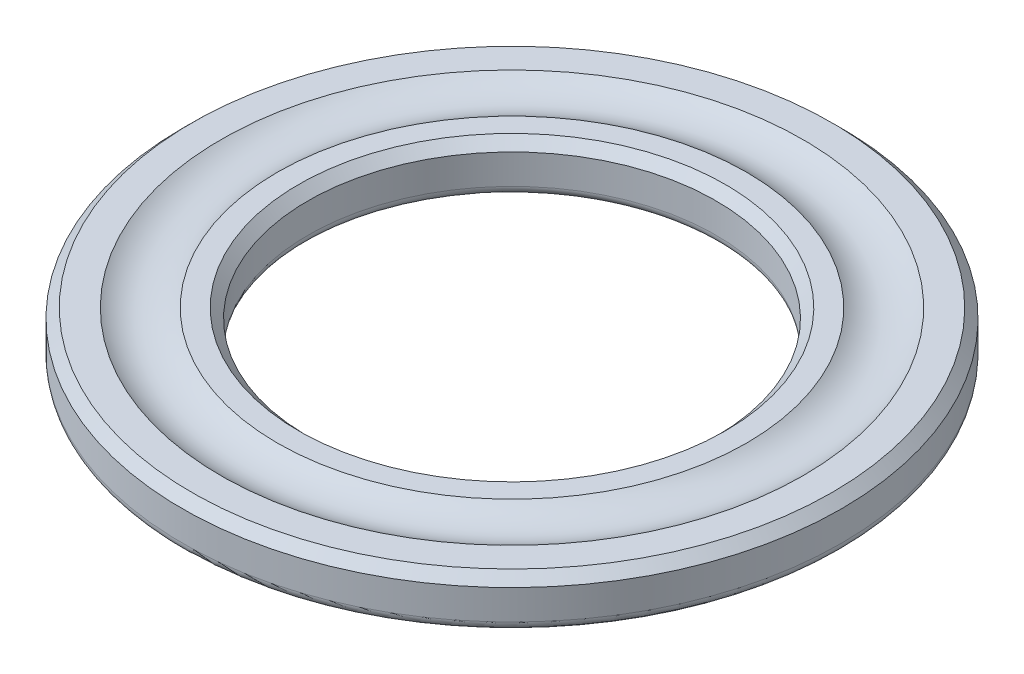
ISO-10303-21;
HEADER;
FILE_DESCRIPTION(('STEP AP214'),'2;1');
FILE_NAME('part.step','',(''),(''),'','','');
FILE_SCHEMA(('AUTOMOTIVE_DESIGN { 1 0 10303 214 1 1 1 1 }'));
ENDSEC;
DATA;
#1=APPLICATION_CONTEXT('core data for automotive mechanical design processes');
#2=APPLICATION_PROTOCOL_DEFINITION('international standard','automotive_design',2000,#1);
#3=PRODUCT_CONTEXT('',#1,'mechanical');
#4=PRODUCT('Part','Part','',(#3));
#5=PRODUCT_RELATED_PRODUCT_CATEGORY('part','',(#4));
#6=PRODUCT_DEFINITION_FORMATION('','',#4);
#7=PRODUCT_DEFINITION_CONTEXT('part definition',#1,'design');
#8=PRODUCT_DEFINITION('design','',#6,#7);
#9=PRODUCT_DEFINITION_SHAPE('','',#8);
#10=(LENGTH_UNIT() NAMED_UNIT(*) SI_UNIT(.MILLI.,.METRE.));
#11=(NAMED_UNIT(*) PLANE_ANGLE_UNIT() SI_UNIT($,.RADIAN.));
#12=(NAMED_UNIT(*) SI_UNIT($,.STERADIAN.) SOLID_ANGLE_UNIT());
#13=UNCERTAINTY_MEASURE_WITH_UNIT(LENGTH_MEASURE(1.E-05),#10,'distance_accuracy_value','');
#14=(GEOMETRIC_REPRESENTATION_CONTEXT(3) GLOBAL_UNCERTAINTY_ASSIGNED_CONTEXT((#13)) GLOBAL_UNIT_ASSIGNED_CONTEXT((#10,
#11,#12)) REPRESENTATION_CONTEXT('',''));
#15=CARTESIAN_POINT('',(0.,0.,0.));
#16=DIRECTION('',(0.,0.,1.));
#17=DIRECTION('',(1.,0.,0.));
#18=AXIS2_PLACEMENT_3D('',#15,#16,#17);
#19=CARTESIAN_POINT('',(17.,0.,0.));
#20=DIRECTION('',(0.,-1.,0.));
#21=DIRECTION('',(-1.,0.,0.));
#22=AXIS2_PLACEMENT_3D('',#19,#20,#21);
#23=PLANE('',#22);
#24=CARTESIAN_POINT('',(0.,0.,0.));
#25=DIRECTION('',(0.,1.,0.));
#26=DIRECTION('',(1.,0.,0.));
#27=AXIS2_PLACEMENT_3D('',#24,#25,#26);
#28=CIRCLE('',#27,13.6);
#29=CARTESIAN_POINT('',(13.6,0.,0.));
#30=VERTEX_POINT('',#29);
#31=EDGE_CURVE('E11',#30,#30,#28,.T.);
#32=ORIENTED_EDGE('',*,*,#31,.T.);
#33=EDGE_LOOP('',(#32));
#34=FACE_BOUND('',#33,.T.);
#35=CARTESIAN_POINT('',(0.,0.,0.));
#36=DIRECTION('',(0.,1.,0.));
#37=DIRECTION('',(1.,0.,0.));
#38=AXIS2_PLACEMENT_3D('',#35,#36,#37);
#39=CIRCLE('',#38,20.4);
#40=CARTESIAN_POINT('',(20.4,0.,0.));
#41=VERTEX_POINT('',#40);
#42=EDGE_CURVE('E48',#41,#41,#39,.T.);
#43=ORIENTED_EDGE('',*,*,#42,.F.);
#44=EDGE_LOOP('',(#43));
#45=FACE_BOUND('',#44,.T.);
#46=ADVANCED_FACE('F17',(#34,#45),#23,.T.);
#47=CARTESIAN_POINT('',(0.,0.6,0.));
#48=DIRECTION('',(0.,1.,0.));
#49=DIRECTION('',(0.,0.,1.));
#50=AXIS2_PLACEMENT_3D('',#47,#48,#49);
#51=TOROIDAL_SURFACE('',#50,13.6,0.6);
#52=CARTESIAN_POINT('',(0.,0.6,0.));
#53=DIRECTION('',(0.,1.,0.));
#54=DIRECTION('',(1.,0.,0.));
#55=AXIS2_PLACEMENT_3D('',#52,#53,#54);
#56=CIRCLE('',#55,13.);
#57=CARTESIAN_POINT('',(13.,0.6,0.));
#58=VERTEX_POINT('',#57);
#59=EDGE_CURVE('E27',#58,#58,#56,.T.);
#60=ORIENTED_EDGE('',*,*,#59,.T.);
#61=EDGE_LOOP('',(#60));
#62=FACE_BOUND('',#61,.T.);
#63=ORIENTED_EDGE('',*,*,#31,.F.);
#64=EDGE_LOOP('',(#63));
#65=FACE_BOUND('',#64,.T.);
#66=ADVANCED_FACE('F85',(#62,#65),#51,.T.);
#67=CARTESIAN_POINT('',(0.,1.55,0.));
#68=DIRECTION('',(0.,-1.,0.));
#69=DIRECTION('',(1.,0.,0.));
#70=AXIS2_PLACEMENT_3D('',#67,#68,#69);
#71=CYLINDRICAL_SURFACE('',#70,13.);
#72=CARTESIAN_POINT('',(0.,2.5,0.));
#73=DIRECTION('',(0.,1.,0.));
#74=DIRECTION('',(1.,0.,0.));
#75=AXIS2_PLACEMENT_3D('',#72,#73,#74);
#76=CIRCLE('',#75,13.);
#77=CARTESIAN_POINT('',(13.,2.5,0.));
#78=VERTEX_POINT('',#77);
#79=EDGE_CURVE('E61',#78,#78,#76,.T.);
#80=ORIENTED_EDGE('',*,*,#79,.T.);
#81=EDGE_LOOP('',(#80));
#82=FACE_BOUND('',#81,.T.);
#83=ORIENTED_EDGE('',*,*,#59,.F.);
#84=EDGE_LOOP('',(#83));
#85=FACE_BOUND('',#84,.T.);
#86=ADVANCED_FACE('F88',(#82,#85),#71,.F.);
#87=CARTESIAN_POINT('',(0.,2.8,0.));
#88=DIRECTION('',(0.,1.,0.));
#89=DIRECTION('',(1.,0.,0.));
#90=AXIS2_PLACEMENT_3D('',#87,#88,#89);
#91=CONICAL_SURFACE('',#90,13.3,0.785398163397448);
#92=CARTESIAN_POINT('',(0.,3.1,0.));
#93=DIRECTION('',(0.,1.,0.));
#94=DIRECTION('',(1.,0.,0.));
#95=AXIS2_PLACEMENT_3D('',#92,#93,#94);
#96=CIRCLE('',#95,13.6);
#97=CARTESIAN_POINT('',(13.6,3.1,0.));
#98=VERTEX_POINT('',#97);
#99=EDGE_CURVE('E65',#98,#98,#96,.T.);
#100=ORIENTED_EDGE('',*,*,#99,.T.);
#101=EDGE_LOOP('',(#100));
#102=FACE_BOUND('',#101,.T.);
#103=ORIENTED_EDGE('',*,*,#79,.F.);
#104=EDGE_LOOP('',(#103));
#105=FACE_BOUND('',#104,.T.);
#106=ADVANCED_FACE('F90',(#102,#105),#91,.F.);
#107=CARTESIAN_POINT('',(14.275,3.1,0.));
#108=DIRECTION('',(0.,1.,0.));
#109=DIRECTION('',(1.,0.,0.));
#110=AXIS2_PLACEMENT_3D('',#107,#108,#109);
#111=PLANE('',#110);
#112=CARTESIAN_POINT('',(0.,3.1,0.));
#113=DIRECTION('',(0.,1.,0.));
#114=DIRECTION('',(1.,0.,0.));
#115=AXIS2_PLACEMENT_3D('',#112,#113,#114);
#116=CIRCLE('',#115,14.95);
#117=CARTESIAN_POINT('',(14.95,3.1,0.));
#118=VERTEX_POINT('',#117);
#119=EDGE_CURVE('E69',#118,#118,#116,.T.);
#120=ORIENTED_EDGE('',*,*,#119,.T.);
#121=EDGE_LOOP('',(#120));
#122=FACE_BOUND('',#121,.T.);
#123=ORIENTED_EDGE('',*,*,#99,.F.);
#124=EDGE_LOOP('',(#123));
#125=FACE_BOUND('',#124,.T.);
#126=ADVANCED_FACE('F70',(#122,#125),#111,.T.);
#127=CARTESIAN_POINT('',(0.,5.5,0.));
#128=DIRECTION('',(0.,1.,0.));
#129=DIRECTION('',(0.,0.,1.));
#130=AXIS2_PLACEMENT_3D('',#127,#128,#129);
#131=TOROIDAL_SURFACE('',#130,16.75,3.);
#132=CARTESIAN_POINT('',(0.,3.1,0.));
#133=DIRECTION('',(0.,1.,0.));
#134=DIRECTION('',(1.,0.,0.));
#135=AXIS2_PLACEMENT_3D('',#132,#133,#134);
#136=CIRCLE('',#135,18.55);
#137=CARTESIAN_POINT('',(18.55,3.1,0.));
#138=VERTEX_POINT('',#137);
#139=EDGE_CURVE('E21',#138,#138,#136,.T.);
#140=ORIENTED_EDGE('',*,*,#139,.T.);
#141=EDGE_LOOP('',(#140));
#142=FACE_BOUND('',#141,.T.);
#143=ORIENTED_EDGE('',*,*,#119,.F.);
#144=EDGE_LOOP('',(#143));
#145=FACE_BOUND('',#144,.T.);
#146=ADVANCED_FACE('F108',(#142,#145),#131,.F.);
#147=CARTESIAN_POINT('',(19.475,3.1,0.));
#148=DIRECTION('',(0.,1.,0.));
#149=DIRECTION('',(1.,0.,0.));
#150=AXIS2_PLACEMENT_3D('',#147,#148,#149);
#151=PLANE('',#150);
#152=CARTESIAN_POINT('',(0.,3.1,0.));
#153=DIRECTION('',(0.,1.,0.));
#154=DIRECTION('',(1.,0.,0.));
#155=AXIS2_PLACEMENT_3D('',#152,#153,#154);
#156=CIRCLE('',#155,20.4);
#157=CARTESIAN_POINT('',(20.4,3.1,0.));
#158=VERTEX_POINT('',#157);
#159=EDGE_CURVE('E75',#158,#158,#156,.T.);
#160=ORIENTED_EDGE('',*,*,#159,.T.);
#161=EDGE_LOOP('',(#160));
#162=FACE_BOUND('',#161,.T.);
#163=ORIENTED_EDGE('',*,*,#139,.F.);
#164=EDGE_LOOP('',(#163));
#165=FACE_BOUND('',#164,.T.);
#166=ADVANCED_FACE('F110',(#162,#165),#151,.T.);
#167=CARTESIAN_POINT('',(0.,2.8,0.));
#168=DIRECTION('',(0.,-1.,0.));
#169=DIRECTION('',(1.,0.,0.));
#170=AXIS2_PLACEMENT_3D('',#167,#168,#169);
#171=CONICAL_SURFACE('',#170,20.7,0.785398163397455);
#172=CARTESIAN_POINT('',(0.,2.5,0.));
#173=DIRECTION('',(0.,1.,0.));
#174=DIRECTION('',(1.,0.,0.));
#175=AXIS2_PLACEMENT_3D('',#172,#173,#174);
#176=CIRCLE('',#175,21.);
#177=CARTESIAN_POINT('',(21.,2.5,0.));
#178=VERTEX_POINT('',#177);
#179=EDGE_CURVE('E78',#178,#178,#176,.T.);
#180=ORIENTED_EDGE('',*,*,#179,.T.);
#181=EDGE_LOOP('',(#180));
#182=FACE_BOUND('',#181,.T.);
#183=ORIENTED_EDGE('',*,*,#159,.F.);
#184=EDGE_LOOP('',(#183));
#185=FACE_BOUND('',#184,.T.);
#186=ADVANCED_FACE('F129',(#182,#185),#171,.T.);
#187=CARTESIAN_POINT('',(0.,1.55,0.));
#188=DIRECTION('',(0.,-1.,0.));
#189=DIRECTION('',(1.,0.,0.));
#190=AXIS2_PLACEMENT_3D('',#187,#188,#189);
#191=CYLINDRICAL_SURFACE('',#190,21.);
#192=CARTESIAN_POINT('',(0.,0.6,0.));
#193=DIRECTION('',(0.,1.,0.));
#194=DIRECTION('',(1.,0.,0.));
#195=AXIS2_PLACEMENT_3D('',#192,#193,#194);
#196=CIRCLE('',#195,21.);
#197=CARTESIAN_POINT('',(21.,0.6,0.));
#198=VERTEX_POINT('',#197);
#199=EDGE_CURVE('E42',#198,#198,#196,.T.);
#200=ORIENTED_EDGE('',*,*,#199,.T.);
#201=EDGE_LOOP('',(#200));
#202=FACE_BOUND('',#201,.T.);
#203=ORIENTED_EDGE('',*,*,#179,.F.);
#204=EDGE_LOOP('',(#203));
#205=FACE_BOUND('',#204,.T.);
#206=ADVANCED_FACE('F19',(#202,#205),#191,.T.);
#207=CARTESIAN_POINT('',(0.,0.6,0.));
#208=DIRECTION('',(0.,1.,0.));
#209=DIRECTION('',(0.,0.,1.));
#210=AXIS2_PLACEMENT_3D('',#207,#208,#209);
#211=TOROIDAL_SURFACE('',#210,20.4,0.6);
#212=ORIENTED_EDGE('',*,*,#42,.T.);
#213=EDGE_LOOP('',(#212));
#214=FACE_BOUND('',#213,.T.);
#215=ORIENTED_EDGE('',*,*,#199,.F.);
#216=EDGE_LOOP('',(#215));
#217=FACE_BOUND('',#216,.T.);
#218=ADVANCED_FACE('F106',(#214,#217),#211,.T.);
#219=CLOSED_SHELL('',(#46,#66,#86,#106,#126,#146,#166,#186,#206,#218));
#220=MANIFOLD_SOLID_BREP('B1',#219);
#221=ADVANCED_BREP_SHAPE_REPRESENTATION('',(#18,#220),#14);
#222=SHAPE_DEFINITION_REPRESENTATION(#9,#221);
ENDSEC;
END-ISO-10303-21;
